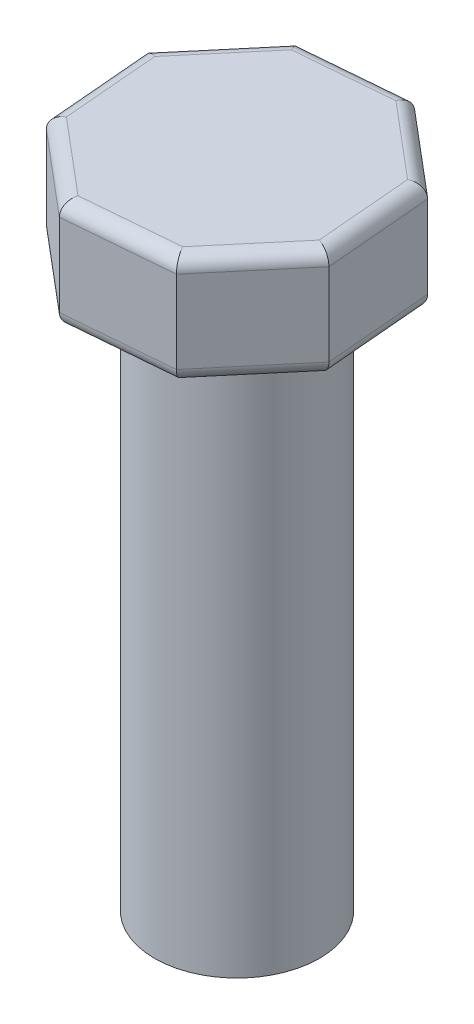
ISO-10303-21;
HEADER;
FILE_DESCRIPTION(('STEP AP214'),'2;1');
FILE_NAME('part.step','',(''),(''),'','','');
FILE_SCHEMA(('AUTOMOTIVE_DESIGN { 1 0 10303 214 1 1 1 1 }'));
ENDSEC;
DATA;
#1=APPLICATION_CONTEXT('core data for automotive mechanical design processes');
#2=APPLICATION_PROTOCOL_DEFINITION('international standard','automotive_design',2000,#1);
#3=PRODUCT_CONTEXT('',#1,'mechanical');
#4=PRODUCT('Part','Part','',(#3));
#5=PRODUCT_RELATED_PRODUCT_CATEGORY('part','',(#4));
#6=PRODUCT_DEFINITION_FORMATION('','',#4);
#7=PRODUCT_DEFINITION_CONTEXT('part definition',#1,'design');
#8=PRODUCT_DEFINITION('design','',#6,#7);
#9=PRODUCT_DEFINITION_SHAPE('','',#8);
#10=(LENGTH_UNIT() NAMED_UNIT(*) SI_UNIT(.MILLI.,.METRE.));
#11=(NAMED_UNIT(*) PLANE_ANGLE_UNIT() SI_UNIT($,.RADIAN.));
#12=(NAMED_UNIT(*) SI_UNIT($,.STERADIAN.) SOLID_ANGLE_UNIT());
#13=UNCERTAINTY_MEASURE_WITH_UNIT(LENGTH_MEASURE(1.E-05),#10,'distance_accuracy_value','');
#14=(GEOMETRIC_REPRESENTATION_CONTEXT(3) GLOBAL_UNCERTAINTY_ASSIGNED_CONTEXT((#13)) GLOBAL_UNIT_ASSIGNED_CONTEXT((#10,
#11,#12)) REPRESENTATION_CONTEXT('',''));
#15=CARTESIAN_POINT('',(0.,0.,0.));
#16=DIRECTION('',(0.,0.,1.));
#17=DIRECTION('',(1.,0.,0.));
#18=AXIS2_PLACEMENT_3D('',#15,#16,#17);
#19=CARTESIAN_POINT('',(0.,0.,0.));
#20=DIRECTION('',(0.,1.,0.));
#21=DIRECTION('',(0.,0.,1.));
#22=AXIS2_PLACEMENT_3D('',#19,#20,#21);
#23=PLANE('',#22);
#24=DIRECTION('',(0.764494083677081,0.,0.644630743932323));
#25=VECTOR('',#24,1.);
#26=CARTESIAN_POINT('',(-5.47936132342475,0.,6.49819971125519));
#27=LINE('',#26,#25);
#28=CARTESIAN_POINT('',(-2.78771887201392,0.,8.76782548456031));
#29=VERTEX_POINT('',#28);
#30=CARTESIAN_POINT('',(-8.17100377483558,0.,4.22857393795007));
#31=VERTEX_POINT('',#30);
#32=EDGE_CURVE('E43',#29,#31,#27,.F.);
#33=ORIENTED_EDGE('',*,*,#32,.T.);
#34=DIRECTION('',(0.0847561803491822,0.,0.996401721140935));
#35=VECTOR('',#34,1.);
#36=CARTESIAN_POINT('',(-8.46941462969793,0.,0.720427532968048));
#37=LINE('',#36,#35);
#38=CARTESIAN_POINT('',(-8.76782548456027,0.,-2.78771887201375));
#39=VERTEX_POINT('',#38);
#40=EDGE_CURVE('E11',#31,#39,#37,.F.);
#41=ORIENTED_EDGE('',*,*,#40,.T.);
#42=DIRECTION('',(-0.644630743932324,0.,0.76449408367708));
#43=VECTOR('',#42,1.);
#44=CARTESIAN_POINT('',(-6.49819971125507,0.,-5.47936132342467));
#45=LINE('',#44,#43);
#46=CARTESIAN_POINT('',(-4.22857393795002,0.,-8.17100377483541));
#47=VERTEX_POINT('',#46);
#48=EDGE_CURVE('E235',#39,#47,#45,.F.);
#49=ORIENTED_EDGE('',*,*,#48,.T.);
#50=DIRECTION('',(-0.996401721140935,0.,0.0847561803491839));
#51=VECTOR('',#50,1.);
#52=CARTESIAN_POINT('',(-0.720427532968049,0.,-8.46941462969777));
#53=LINE('',#52,#51);
#54=CARTESIAN_POINT('',(2.78771887201394,0.,-8.76782548456013));
#55=VERTEX_POINT('',#54);
#56=EDGE_CURVE('E233',#47,#55,#53,.F.);
#57=ORIENTED_EDGE('',*,*,#56,.T.);
#58=DIRECTION('',(-0.764494083677079,0.,-0.644630743932325));
#59=VECTOR('',#58,1.);
#60=CARTESIAN_POINT('',(5.47936132342468,0.,-6.49819971125508));
#61=LINE('',#60,#59);
#62=CARTESIAN_POINT('',(8.1710037748356,0.,-4.22857393794987));
#63=VERTEX_POINT('',#62);
#64=EDGE_CURVE('E231',#55,#63,#61,.F.);
#65=ORIENTED_EDGE('',*,*,#64,.T.);
#66=DIRECTION('',(-0.0847561803491809,0.,-0.996401721140935));
#67=VECTOR('',#66,1.);
#68=CARTESIAN_POINT('',(8.46941462969794,0.,-0.720427532968037));
#69=LINE('',#68,#67);
#70=CARTESIAN_POINT('',(8.7678254845603,0.,2.78771887201405));
#71=VERTEX_POINT('',#70);
#72=EDGE_CURVE('E229',#63,#71,#69,.F.);
#73=ORIENTED_EDGE('',*,*,#72,.T.);
#74=DIRECTION('',(0.644630743932331,0.,-0.764494083677074));
#75=VECTOR('',#74,1.);
#76=CARTESIAN_POINT('',(6.49819971125516,0.,5.47936132342484));
#77=LINE('',#76,#75);
#78=CARTESIAN_POINT('',(4.22857393795007,0.,8.17100377483558));
#79=VERTEX_POINT('',#78);
#80=EDGE_CURVE('E227',#71,#79,#77,.F.);
#81=ORIENTED_EDGE('',*,*,#80,.T.);
#82=DIRECTION('',(0.996401721140935,0.,-0.0847561803491851));
#83=VECTOR('',#82,1.);
#84=CARTESIAN_POINT('',(0.720427532968073,0.,8.46941462969794));
#85=LINE('',#84,#83);
#86=EDGE_CURVE('E225',#79,#29,#85,.F.);
#87=ORIENTED_EDGE('',*,*,#86,.T.);
#88=EDGE_LOOP('',(#33,#41,#49,#57,#65,#73,#81,#87));
#89=FACE_BOUND('',#88,.T.);
#90=CARTESIAN_POINT('',(0.,0.,0.));
#91=DIRECTION('',(0.,1.,0.));
#92=DIRECTION('',(0.,0.,1.));
#93=AXIS2_PLACEMENT_3D('',#90,#91,#92);
#94=CIRCLE('',#93,6.);
#95=CARTESIAN_POINT('',(0.,0.,6.));
#96=VERTEX_POINT('',#95);
#97=EDGE_CURVE('E174',#96,#96,#94,.F.);
#98=ORIENTED_EDGE('',*,*,#97,.F.);
#99=EDGE_LOOP('',(#98));
#100=FACE_BOUND('',#99,.T.);
#101=ADVANCED_FACE('F34',(#89,#100),#23,.F.);
#102=CARTESIAN_POINT('',(3.11568579813323,8.,-9.79933436509664));
#103=DIRECTION('',(0.0847561803491839,0.,0.996401721140935));
#104=DIRECTION('',(0.996401721140935,0.,-0.0847561803491839));
#105=AXIS2_PLACEMENT_3D('',#102,#103,#104);
#106=PLANE('',#105);
#107=DIRECTION('',(0.,-1.,0.));
#108=VECTOR('',#107,1.);
#109=CARTESIAN_POINT('',(-4.72605322476767,8.,-9.13229833658077));
#110=LINE('',#109,#108);
#111=CARTESIAN_POINT('',(-4.72605322476767,7.,-9.13229833658077));
#112=VERTEX_POINT('',#111);
#113=CARTESIAN_POINT('',(-4.72605322476767,1.,-9.13229833658077));
#114=VERTEX_POINT('',#113);
#115=EDGE_CURVE('E177',#112,#114,#110,.T.);
#116=ORIENTED_EDGE('',*,*,#115,.F.);
#117=DIRECTION('',(-0.996401721140935,0.,0.0847561803491839));
#118=VECTOR('',#117,1.);
#119=CARTESIAN_POINT('',(3.11568579813323,7.,-9.79933436509664));
#120=LINE('',#119,#118);
#121=CARTESIAN_POINT('',(3.11568579813323,7.,-9.79933436509664));
#122=VERTEX_POINT('',#121);
#123=EDGE_CURVE('E203',#112,#122,#120,.F.);
#124=ORIENTED_EDGE('',*,*,#123,.T.);
#125=DIRECTION('',(0.,-1.,0.));
#126=VECTOR('',#125,1.);
#127=CARTESIAN_POINT('',(3.11568579813323,8.,-9.79933436509664));
#128=LINE('',#127,#126);
#129=CARTESIAN_POINT('',(3.11568579813323,1.,-9.79933436509664));
#130=VERTEX_POINT('',#129);
#131=EDGE_CURVE('E323',#122,#130,#128,.T.);
#132=ORIENTED_EDGE('',*,*,#131,.T.);
#133=DIRECTION('',(-0.996401721140935,0.,0.0847561803491839));
#134=VECTOR('',#133,1.);
#135=CARTESIAN_POINT('',(3.11568579813323,1.,-9.79933436509664));
#136=LINE('',#135,#134);
#137=EDGE_CURVE('E201',#130,#114,#136,.T.);
#138=ORIENTED_EDGE('',*,*,#137,.T.);
#139=EDGE_LOOP('',(#116,#124,#132,#138));
#140=FACE_BOUND('',#139,.T.);
#141=ADVANCED_FACE('F337',(#140),#106,.F.);
#142=CARTESIAN_POINT('',(-4.72605322476767,8.,-9.13229833658077));
#143=DIRECTION('',(0.76449408367708,0.,0.644630743932324));
#144=DIRECTION('',(0.644630743932324,0.,-0.76449408367708));
#145=AXIS2_PLACEMENT_3D('',#142,#143,#144);
#146=PLANE('',#145);
#147=DIRECTION('',(0.,-1.,0.));
#148=VECTOR('',#147,1.);
#149=CARTESIAN_POINT('',(-9.79933436509678,8.,-3.11568579813304));
#150=LINE('',#149,#148);
#151=CARTESIAN_POINT('',(-9.79933436509678,7.,-3.11568579813304));
#152=VERTEX_POINT('',#151);
#153=CARTESIAN_POINT('',(-9.79933436509678,1.,-3.11568579813304));
#154=VERTEX_POINT('',#153);
#155=EDGE_CURVE('E299',#152,#154,#150,.T.);
#156=ORIENTED_EDGE('',*,*,#155,.F.);
#157=DIRECTION('',(-0.644630743932324,0.,0.76449408367708));
#158=VECTOR('',#157,1.);
#159=CARTESIAN_POINT('',(-4.72605322476767,7.,-9.13229833658077));
#160=LINE('',#159,#158);
#161=EDGE_CURVE('E207',#152,#112,#160,.F.);
#162=ORIENTED_EDGE('',*,*,#161,.T.);
#163=ORIENTED_EDGE('',*,*,#115,.T.);
#164=DIRECTION('',(-0.644630743932324,0.,0.76449408367708));
#165=VECTOR('',#164,1.);
#166=CARTESIAN_POINT('',(-4.72605322476767,1.,-9.13229833658077));
#167=LINE('',#166,#165);
#168=EDGE_CURVE('E205',#114,#154,#167,.T.);
#169=ORIENTED_EDGE('',*,*,#168,.T.);
#170=EDGE_LOOP('',(#156,#162,#163,#169));
#171=FACE_BOUND('',#170,.T.);
#172=ADVANCED_FACE('F298',(#171),#146,.F.);
#173=CARTESIAN_POINT('',(-9.79933436509678,8.,-3.11568579813304));
#174=DIRECTION('',(0.996401721140935,0.,-0.0847561803491822));
#175=DIRECTION('',(-0.0847561803491822,0.,-0.996401721140935));
#176=AXIS2_PLACEMENT_3D('',#173,#174,#175);
#177=PLANE('',#176);
#178=DIRECTION('',(0.,-1.,0.));
#179=VECTOR('',#178,1.);
#180=CARTESIAN_POINT('',(-9.13229833658094,8.,4.72605322476772));
#181=LINE('',#180,#179);
#182=CARTESIAN_POINT('',(-9.13229833658094,7.,4.72605322476772));
#183=VERTEX_POINT('',#182);
#184=CARTESIAN_POINT('',(-9.13229833658094,1.,4.72605322476772));
#185=VERTEX_POINT('',#184);
#186=EDGE_CURVE('E307',#183,#185,#181,.T.);
#187=ORIENTED_EDGE('',*,*,#186,.F.);
#188=DIRECTION('',(0.0847561803491822,0.,0.996401721140935));
#189=VECTOR('',#188,1.);
#190=CARTESIAN_POINT('',(-9.79933436509678,7.,-3.11568579813304));
#191=LINE('',#190,#189);
#192=EDGE_CURVE('E212',#183,#152,#191,.F.);
#193=ORIENTED_EDGE('',*,*,#192,.T.);
#194=ORIENTED_EDGE('',*,*,#155,.T.);
#195=DIRECTION('',(0.0847561803491822,0.,0.996401721140935));
#196=VECTOR('',#195,1.);
#197=CARTESIAN_POINT('',(-9.79933436509678,1.,-3.11568579813304));
#198=LINE('',#197,#196);
#199=EDGE_CURVE('E209',#154,#185,#198,.T.);
#200=ORIENTED_EDGE('',*,*,#199,.T.);
#201=EDGE_LOOP('',(#187,#193,#194,#200));
#202=FACE_BOUND('',#201,.T.);
#203=ADVANCED_FACE('F304',(#202),#177,.F.);
#204=CARTESIAN_POINT('',(-9.13229833658094,8.,4.72605322476772));
#205=DIRECTION('',(0.644630743932323,0.,-0.764494083677081));
#206=DIRECTION('',(-0.764494083677081,0.,-0.644630743932323));
#207=AXIS2_PLACEMENT_3D('',#204,#205,#206);
#208=PLANE('',#207);
#209=DIRECTION('',(0.,-1.,0.));
#210=VECTOR('',#209,1.);
#211=CARTESIAN_POINT('',(-3.1156857981332,8.,9.79933436509682));
#212=LINE('',#211,#210);
#213=CARTESIAN_POINT('',(-3.1156857981332,7.,9.79933436509682));
#214=VERTEX_POINT('',#213);
#215=CARTESIAN_POINT('',(-3.1156857981332,1.,9.79933436509682));
#216=VERTEX_POINT('',#215);
#217=EDGE_CURVE('E309',#214,#216,#212,.T.);
#218=ORIENTED_EDGE('',*,*,#217,.F.);
#219=DIRECTION('',(0.764494083677081,0.,0.644630743932323));
#220=VECTOR('',#219,1.);
#221=CARTESIAN_POINT('',(-9.13229833658094,7.,4.72605322476772));
#222=LINE('',#221,#220);
#223=EDGE_CURVE('E216',#214,#183,#222,.F.);
#224=ORIENTED_EDGE('',*,*,#223,.T.);
#225=ORIENTED_EDGE('',*,*,#186,.T.);
#226=DIRECTION('',(0.764494083677081,0.,0.644630743932323));
#227=VECTOR('',#226,1.);
#228=CARTESIAN_POINT('',(-9.13229833658094,1.,4.72605322476772));
#229=LINE('',#228,#227);
#230=EDGE_CURVE('E214',#185,#216,#229,.T.);
#231=ORIENTED_EDGE('',*,*,#230,.T.);
#232=EDGE_LOOP('',(#218,#224,#225,#231));
#233=FACE_BOUND('',#232,.T.);
#234=ADVANCED_FACE('F361',(#233),#208,.F.);
#235=CARTESIAN_POINT('',(-3.1156857981332,8.,9.79933436509682));
#236=DIRECTION('',(-0.0847561803491851,0.,-0.996401721140934));
#237=DIRECTION('',(-0.996401721140935,0.,0.0847561803491851));
#238=AXIS2_PLACEMENT_3D('',#235,#236,#237);
#239=PLANE('',#238);
#240=DIRECTION('',(0.,-1.,0.));
#241=VECTOR('',#240,1.);
#242=CARTESIAN_POINT('',(4.72605322476772,8.,9.13229833658094));
#243=LINE('',#242,#241);
#244=CARTESIAN_POINT('',(4.72605322476772,7.,9.13229833658094));
#245=VERTEX_POINT('',#244);
#246=CARTESIAN_POINT('',(4.72605322476772,1.,9.13229833658094));
#247=VERTEX_POINT('',#246);
#248=EDGE_CURVE('E314',#245,#247,#243,.T.);
#249=ORIENTED_EDGE('',*,*,#248,.F.);
#250=DIRECTION('',(0.996401721140935,0.,-0.0847561803491851));
#251=VECTOR('',#250,1.);
#252=CARTESIAN_POINT('',(-3.1156857981332,7.,9.79933436509682));
#253=LINE('',#252,#251);
#254=EDGE_CURVE('E165',#245,#214,#253,.F.);
#255=ORIENTED_EDGE('',*,*,#254,.T.);
#256=ORIENTED_EDGE('',*,*,#217,.T.);
#257=DIRECTION('',(0.996401721140935,0.,-0.0847561803491851));
#258=VECTOR('',#257,1.);
#259=CARTESIAN_POINT('',(-3.1156857981332,1.,9.79933436509682));
#260=LINE('',#259,#258);
#261=EDGE_CURVE('E218',#216,#247,#260,.T.);
#262=ORIENTED_EDGE('',*,*,#261,.T.);
#263=EDGE_LOOP('',(#249,#255,#256,#262));
#264=FACE_BOUND('',#263,.T.);
#265=ADVANCED_FACE('F357',(#264),#239,.F.);
#266=CARTESIAN_POINT('',(4.72605322476772,8.,9.13229833658094));
#267=DIRECTION('',(-0.764494083677074,0.,-0.644630743932331));
#268=DIRECTION('',(-0.644630743932331,0.,0.764494083677074));
#269=AXIS2_PLACEMENT_3D('',#266,#267,#268);
#270=PLANE('',#269);
#271=DIRECTION('',(0.,-1.,0.));
#272=VECTOR('',#271,1.);
#273=CARTESIAN_POINT('',(9.79933436509681,8.,3.11568579813334));
#274=LINE('',#273,#272);
#275=CARTESIAN_POINT('',(9.79933436509681,7.,3.11568579813334));
#276=VERTEX_POINT('',#275);
#277=CARTESIAN_POINT('',(9.79933436509681,1.,3.11568579813334));
#278=VERTEX_POINT('',#277);
#279=EDGE_CURVE('E317',#276,#278,#274,.T.);
#280=ORIENTED_EDGE('',*,*,#279,.F.);
#281=DIRECTION('',(0.644630743932331,0.,-0.764494083677074));
#282=VECTOR('',#281,1.);
#283=CARTESIAN_POINT('',(4.72605322476772,7.,9.13229833658094));
#284=LINE('',#283,#282);
#285=EDGE_CURVE('E223',#276,#245,#284,.F.);
#286=ORIENTED_EDGE('',*,*,#285,.T.);
#287=ORIENTED_EDGE('',*,*,#248,.T.);
#288=DIRECTION('',(0.644630743932331,0.,-0.764494083677074));
#289=VECTOR('',#288,1.);
#290=CARTESIAN_POINT('',(4.72605322476772,1.,9.13229833658094));
#291=LINE('',#290,#289);
#292=EDGE_CURVE('E221',#247,#278,#291,.T.);
#293=ORIENTED_EDGE('',*,*,#292,.T.);
#294=EDGE_LOOP('',(#280,#286,#287,#293));
#295=FACE_BOUND('',#294,.T.);
#296=ADVANCED_FACE('F353',(#295),#270,.F.);
#297=CARTESIAN_POINT('',(9.79933436509681,8.,3.11568579813334));
#298=DIRECTION('',(-0.996401721140935,0.,0.0847561803491809));
#299=DIRECTION('',(0.0847561803491809,0.,0.996401721140935));
#300=AXIS2_PLACEMENT_3D('',#297,#298,#299);
#301=PLANE('',#300);
#302=DIRECTION('',(0.,-1.,0.));
#303=VECTOR('',#302,1.);
#304=CARTESIAN_POINT('',(9.13229833658097,8.,-4.72605322476752));
#305=LINE('',#304,#303);
#306=CARTESIAN_POINT('',(9.13229833658097,7.,-4.72605322476752));
#307=VERTEX_POINT('',#306);
#308=CARTESIAN_POINT('',(9.13229833658097,1.,-4.72605322476752));
#309=VERTEX_POINT('',#308);
#310=EDGE_CURVE('E320',#307,#309,#305,.T.);
#311=ORIENTED_EDGE('',*,*,#310,.F.);
#312=DIRECTION('',(-0.0847561803491809,0.,-0.996401721140935));
#313=VECTOR('',#312,1.);
#314=CARTESIAN_POINT('',(9.79933436509681,7.,3.11568579813334));
#315=LINE('',#314,#313);
#316=EDGE_CURVE('E194',#307,#276,#315,.F.);
#317=ORIENTED_EDGE('',*,*,#316,.T.);
#318=ORIENTED_EDGE('',*,*,#279,.T.);
#319=DIRECTION('',(-0.0847561803491809,0.,-0.996401721140935));
#320=VECTOR('',#319,1.);
#321=CARTESIAN_POINT('',(9.79933436509681,1.,3.11568579813334));
#322=LINE('',#321,#320);
#323=EDGE_CURVE('E192',#278,#309,#322,.T.);
#324=ORIENTED_EDGE('',*,*,#323,.T.);
#325=EDGE_LOOP('',(#311,#317,#318,#324));
#326=FACE_BOUND('',#325,.T.);
#327=ADVANCED_FACE('F349',(#326),#301,.F.);
#328=CARTESIAN_POINT('',(9.13229833658097,8.,-4.72605322476752));
#329=DIRECTION('',(-0.644630743932325,0.,0.764494083677079));
#330=DIRECTION('',(0.764494083677079,0.,0.644630743932325));
#331=AXIS2_PLACEMENT_3D('',#328,#329,#330);
#332=PLANE('',#331);
#333=ORIENTED_EDGE('',*,*,#131,.F.);
#334=DIRECTION('',(-0.764494083677079,0.,-0.644630743932325));
#335=VECTOR('',#334,1.);
#336=CARTESIAN_POINT('',(9.13229833658097,7.,-4.72605322476752));
#337=LINE('',#336,#335);
#338=EDGE_CURVE('E199',#122,#307,#337,.F.);
#339=ORIENTED_EDGE('',*,*,#338,.T.);
#340=ORIENTED_EDGE('',*,*,#310,.T.);
#341=DIRECTION('',(-0.764494083677079,0.,-0.644630743932325));
#342=VECTOR('',#341,1.);
#343=CARTESIAN_POINT('',(9.13229833658097,1.,-4.72605322476752));
#344=LINE('',#343,#342);
#345=EDGE_CURVE('E197',#309,#130,#344,.T.);
#346=ORIENTED_EDGE('',*,*,#345,.T.);
#347=EDGE_LOOP('',(#333,#339,#340,#346));
#348=FACE_BOUND('',#347,.T.);
#349=ADVANCED_FACE('F346',(#348),#332,.F.);
#350=CARTESIAN_POINT('',(0.,8.,0.));
#351=DIRECTION('',(0.,1.,0.));
#352=DIRECTION('',(0.,0.,1.));
#353=AXIS2_PLACEMENT_3D('',#350,#351,#352);
#354=PLANE('',#353);
#355=DIRECTION('',(0.644630743932331,0.,-0.764494083677074));
#356=VECTOR('',#355,1.);
#357=CARTESIAN_POINT('',(9.03484028141973,8.,2.47105505420101));
#358=LINE('',#357,#356);
#359=CARTESIAN_POINT('',(4.22857393795007,8.,8.17100377483558));
#360=VERTEX_POINT('',#359);
#361=CARTESIAN_POINT('',(8.7678254845603,8.,2.78771887201405));
#362=VERTEX_POINT('',#361);
#363=EDGE_CURVE('E153',#360,#362,#358,.T.);
#364=ORIENTED_EDGE('',*,*,#363,.T.);
#365=DIRECTION('',(-0.0847561803491809,0.,-0.996401721140935));
#366=VECTOR('',#365,1.);
#367=CARTESIAN_POINT('',(8.13589661544003,8.,-4.64129704441834));
#368=LINE('',#367,#366);
#369=CARTESIAN_POINT('',(8.1710037748356,8.,-4.22857393794986));
#370=VERTEX_POINT('',#369);
#371=EDGE_CURVE('E190',#362,#370,#368,.T.);
#372=ORIENTED_EDGE('',*,*,#371,.T.);
#373=DIRECTION('',(-0.764494083677079,0.,-0.644630743932325));
#374=VECTOR('',#373,1.);
#375=CARTESIAN_POINT('',(2.47105505420091,8.,-9.03484028141956));
#376=LINE('',#375,#374);
#377=CARTESIAN_POINT('',(2.78771887201394,8.,-8.76782548456013));
#378=VERTEX_POINT('',#377);
#379=EDGE_CURVE('E188',#370,#378,#376,.T.);
#380=ORIENTED_EDGE('',*,*,#379,.T.);
#381=DIRECTION('',(-0.996401721140935,0.,0.0847561803491839));
#382=VECTOR('',#381,1.);
#383=CARTESIAN_POINT('',(-4.64129704441849,8.,-8.13589661543984));
#384=LINE('',#383,#382);
#385=CARTESIAN_POINT('',(-4.22857393795002,8.,-8.17100377483541));
#386=VERTEX_POINT('',#385);
#387=EDGE_CURVE('E186',#378,#386,#384,.T.);
#388=ORIENTED_EDGE('',*,*,#387,.T.);
#389=DIRECTION('',(-0.644630743932324,0.,0.76449408367708));
#390=VECTOR('',#389,1.);
#391=CARTESIAN_POINT('',(-9.0348402814197,8.,-2.47105505420072));
#392=LINE('',#391,#390);
#393=CARTESIAN_POINT('',(-8.76782548456027,8.,-2.78771887201375));
#394=VERTEX_POINT('',#393);
#395=EDGE_CURVE('E184',#386,#394,#392,.T.);
#396=ORIENTED_EDGE('',*,*,#395,.T.);
#397=DIRECTION('',(0.0847561803491822,0.,0.996401721140935));
#398=VECTOR('',#397,1.);
#399=CARTESIAN_POINT('',(-8.13589661544001,8.,4.64129704441854));
#400=LINE('',#399,#398);
#401=CARTESIAN_POINT('',(-8.17100377483558,8.,4.22857393795007));
#402=VERTEX_POINT('',#401);
#403=EDGE_CURVE('E182',#394,#402,#400,.T.);
#404=ORIENTED_EDGE('',*,*,#403,.T.);
#405=DIRECTION('',(0.764494083677081,0.,0.644630743932323));
#406=VECTOR('',#405,1.);
#407=CARTESIAN_POINT('',(-2.47105505420088,8.,9.03484028141974));
#408=LINE('',#407,#406);
#409=CARTESIAN_POINT('',(-2.78771887201392,8.,8.76782548456031));
#410=VERTEX_POINT('',#409);
#411=EDGE_CURVE('E156',#402,#410,#408,.T.);
#412=ORIENTED_EDGE('',*,*,#411,.T.);
#413=DIRECTION('',(0.996401721140935,0.,-0.0847561803491851));
#414=VECTOR('',#413,1.);
#415=CARTESIAN_POINT('',(4.64129704441854,8.,8.13589661544001));
#416=LINE('',#415,#414);
#417=EDGE_CURVE('E148',#410,#360,#416,.T.);
#418=ORIENTED_EDGE('',*,*,#417,.T.);
#419=EDGE_LOOP('',(#364,#372,#380,#388,#396,#404,#412,#418));
#420=FACE_BOUND('',#419,.T.);
#421=ADVANCED_FACE('F150',(#420),#354,.T.);
#422=CARTESIAN_POINT('',(0.,-40.,0.));
#423=DIRECTION('',(0.,1.,0.));
#424=DIRECTION('',(0.,0.,1.));
#425=AXIS2_PLACEMENT_3D('',#422,#423,#424);
#426=CYLINDRICAL_SURFACE('',#425,6.);
#427=CARTESIAN_POINT('',(0.,-40.,0.));
#428=DIRECTION('',(0.,-1.,0.));
#429=DIRECTION('',(0.,0.,-1.));
#430=AXIS2_PLACEMENT_3D('',#427,#428,#429);
#431=CIRCLE('',#430,6.);
#432=CARTESIAN_POINT('',(0.,-40.,-6.));
#433=VERTEX_POINT('',#432);
#434=EDGE_CURVE('E253',#433,#433,#431,.T.);
#435=ORIENTED_EDGE('',*,*,#434,.F.);
#436=EDGE_LOOP('',(#435));
#437=FACE_BOUND('',#436,.T.);
#438=ORIENTED_EDGE('',*,*,#97,.T.);
#439=EDGE_LOOP('',(#438));
#440=FACE_BOUND('',#439,.T.);
#441=ADVANCED_FACE('F331',(#437,#440),#426,.T.);
#442=CARTESIAN_POINT('',(0.,-40.,0.));
#443=DIRECTION('',(0.,-1.,0.));
#444=DIRECTION('',(0.,0.,-1.));
#445=AXIS2_PLACEMENT_3D('',#442,#443,#444);
#446=PLANE('',#445);
#447=ORIENTED_EDGE('',*,*,#434,.T.);
#448=EDGE_LOOP('',(#447));
#449=FACE_BOUND('',#448,.T.);
#450=ADVANCED_FACE('F329',(#449),#446,.T.);
#451=CARTESIAN_POINT('',(-8.46941462969793,7.,0.720427532968048));
#452=DIRECTION('',(-0.0847561803491822,0.,-0.996401721140935));
#453=DIRECTION('',(-0.996401721140935,0.,0.0847561803491822));
#454=AXIS2_PLACEMENT_3D('',#451,#452,#453);
#455=CYLINDRICAL_SURFACE('',#454,1.);
#456=CARTESIAN_POINT('',(-8.76782548456027,7.,-2.78771887201375));
#457=DIRECTION('',(0.30300193038225,0.,-0.952989942331308));
#458=DIRECTION('',(-0.952989942331308,0.,-0.303001930382251));
#459=AXIS2_PLACEMENT_3D('',#456,#457,#458);
#460=ELLIPSE('',#459,1.08239220029239,1.);
#461=EDGE_CURVE('E247',#152,#394,#460,.T.);
#462=ORIENTED_EDGE('',*,*,#461,.F.);
#463=ORIENTED_EDGE('',*,*,#192,.F.);
#464=CARTESIAN_POINT('',(-8.17100377483557,7.,4.22857393795007));
#465=DIRECTION('',(-0.459610930939142,0.,-0.888120370310948));
#466=DIRECTION('',(-0.888120370310948,0.,0.459610930939142));
#467=AXIS2_PLACEMENT_3D('',#464,#465,#466);
#468=ELLIPSE('',#467,1.08239220029239,1.);
#469=EDGE_CURVE('E250',#402,#183,#468,.F.);
#470=ORIENTED_EDGE('',*,*,#469,.F.);
#471=ORIENTED_EDGE('',*,*,#403,.F.);
#472=EDGE_LOOP('',(#462,#463,#470,#471));
#473=FACE_BOUND('',#472,.T.);
#474=ADVANCED_FACE('F393',(#473),#455,.T.);
#475=CARTESIAN_POINT('',(-5.47936132342475,7.,6.49819971125519));
#476=DIRECTION('',(-0.764494083677081,0.,-0.644630743932323));
#477=DIRECTION('',(-0.644630743932323,0.,0.764494083677081));
#478=AXIS2_PLACEMENT_3D('',#475,#476,#477);
#479=CYLINDRICAL_SURFACE('',#478,1.);
#480=ORIENTED_EDGE('',*,*,#469,.T.);
#481=ORIENTED_EDGE('',*,*,#223,.F.);
#482=CARTESIAN_POINT('',(-2.78771887201392,7.,8.76782548456031));
#483=DIRECTION('',(-0.952989942331309,0.,-0.303001930382248));
#484=DIRECTION('',(-0.303001930382249,0.,0.952989942331309));
#485=AXIS2_PLACEMENT_3D('',#482,#483,#484);
#486=ELLIPSE('',#485,1.08239220029239,1.);
#487=EDGE_CURVE('E245',#410,#214,#486,.F.);
#488=ORIENTED_EDGE('',*,*,#487,.F.);
#489=ORIENTED_EDGE('',*,*,#411,.F.);
#490=EDGE_LOOP('',(#480,#481,#488,#489));
#491=FACE_BOUND('',#490,.T.);
#492=ADVANCED_FACE('F389',(#491),#479,.T.);
#493=CARTESIAN_POINT('',(-6.49819971125507,7.,-5.47936132342467));
#494=DIRECTION('',(0.644630743932324,0.,-0.76449408367708));
#495=DIRECTION('',(-0.76449408367708,0.,-0.644630743932324));
#496=AXIS2_PLACEMENT_3D('',#493,#494,#495);
#497=CYLINDRICAL_SURFACE('',#496,1.);
#498=ORIENTED_EDGE('',*,*,#461,.T.);
#499=ORIENTED_EDGE('',*,*,#395,.F.);
#500=CARTESIAN_POINT('',(-4.22857393795002,7.,-8.17100377483541));
#501=DIRECTION('',(0.888120370310948,0.,-0.459610930939142));
#502=DIRECTION('',(-0.459610930939142,0.,-0.888120370310948));
#503=AXIS2_PLACEMENT_3D('',#500,#501,#502);
#504=ELLIPSE('',#503,1.08239220029239,1.);
#505=EDGE_CURVE('E168',#112,#386,#504,.T.);
#506=ORIENTED_EDGE('',*,*,#505,.F.);
#507=ORIENTED_EDGE('',*,*,#161,.F.);
#508=EDGE_LOOP('',(#498,#499,#506,#507));
#509=FACE_BOUND('',#508,.T.);
#510=ADVANCED_FACE('F386',(#509),#497,.T.);
#511=CARTESIAN_POINT('',(0.720427532968073,7.,8.46941462969794));
#512=DIRECTION('',(-0.996401721140935,0.,0.0847561803491851));
#513=DIRECTION('',(0.0847561803491851,0.,0.996401721140934));
#514=AXIS2_PLACEMENT_3D('',#511,#512,#513);
#515=CYLINDRICAL_SURFACE('',#514,1.);
#516=ORIENTED_EDGE('',*,*,#487,.T.);
#517=ORIENTED_EDGE('',*,*,#254,.F.);
#518=CARTESIAN_POINT('',(4.22857393795007,7.,8.17100377483558));
#519=DIRECTION('',(-0.88812037031095,0.,0.459610930939139));
#520=DIRECTION('',(0.459610930939139,0.,0.88812037031095));
#521=AXIS2_PLACEMENT_3D('',#518,#519,#520);
#522=ELLIPSE('',#521,1.08239220029239,1.);
#523=EDGE_CURVE('E163',#360,#245,#522,.F.);
#524=ORIENTED_EDGE('',*,*,#523,.F.);
#525=ORIENTED_EDGE('',*,*,#417,.F.);
#526=EDGE_LOOP('',(#516,#517,#524,#525));
#527=FACE_BOUND('',#526,.T.);
#528=ADVANCED_FACE('F164',(#527),#515,.T.);
#529=CARTESIAN_POINT('',(-0.720427532968049,7.,-8.46941462969777));
#530=DIRECTION('',(0.996401721140935,0.,-0.0847561803491839));
#531=DIRECTION('',(-0.0847561803491839,0.,-0.996401721140935));
#532=AXIS2_PLACEMENT_3D('',#529,#530,#531);
#533=CYLINDRICAL_SURFACE('',#532,1.);
#534=ORIENTED_EDGE('',*,*,#505,.T.);
#535=ORIENTED_EDGE('',*,*,#387,.F.);
#536=CARTESIAN_POINT('',(2.78771887201395,7.,-8.76782548456013));
#537=DIRECTION('',(0.952989942331308,0.,0.30300193038225));
#538=DIRECTION('',(0.30300193038225,0.,-0.952989942331308));
#539=AXIS2_PLACEMENT_3D('',#536,#537,#538);
#540=ELLIPSE('',#539,1.08239220029239,1.);
#541=EDGE_CURVE('E169',#122,#378,#540,.T.);
#542=ORIENTED_EDGE('',*,*,#541,.F.);
#543=ORIENTED_EDGE('',*,*,#123,.F.);
#544=EDGE_LOOP('',(#534,#535,#542,#543));
#545=FACE_BOUND('',#544,.T.);
#546=ADVANCED_FACE('F380',(#545),#533,.T.);
#547=CARTESIAN_POINT('',(6.49819971125516,7.,5.47936132342484));
#548=DIRECTION('',(-0.644630743932331,0.,0.764494083677074));
#549=DIRECTION('',(0.764494083677074,0.,0.644630743932331));
#550=AXIS2_PLACEMENT_3D('',#547,#548,#549);
#551=CYLINDRICAL_SURFACE('',#550,1.);
#552=ORIENTED_EDGE('',*,*,#523,.T.);
#553=ORIENTED_EDGE('',*,*,#285,.F.);
#554=CARTESIAN_POINT('',(8.7678254845603,7.,2.78771887201405));
#555=DIRECTION('',(-0.303001930382255,0.,0.952989942331306));
#556=DIRECTION('',(-0.952989942331307,0.,-0.303001930382255));
#557=AXIS2_PLACEMENT_3D('',#554,#555,#556);
#558=ELLIPSE('',#557,1.0823922002924,1.);
#559=EDGE_CURVE('E172',#362,#276,#558,.F.);
#560=ORIENTED_EDGE('',*,*,#559,.F.);
#561=ORIENTED_EDGE('',*,*,#363,.F.);
#562=EDGE_LOOP('',(#552,#553,#560,#561));
#563=FACE_BOUND('',#562,.T.);
#564=ADVANCED_FACE('F171',(#563),#551,.T.);
#565=CARTESIAN_POINT('',(5.47936132342468,7.,-6.49819971125508));
#566=DIRECTION('',(0.764494083677079,0.,0.644630743932325));
#567=DIRECTION('',(0.644630743932325,0.,-0.764494083677079));
#568=AXIS2_PLACEMENT_3D('',#565,#566,#567);
#569=CYLINDRICAL_SURFACE('',#568,1.);
#570=ORIENTED_EDGE('',*,*,#541,.T.);
#571=ORIENTED_EDGE('',*,*,#379,.F.);
#572=CARTESIAN_POINT('',(8.1710037748356,7.,-4.22857393794986));
#573=DIRECTION('',(0.45961093093914,0.,0.888120370310949));
#574=DIRECTION('',(0.888120370310949,0.,-0.45961093093914));
#575=AXIS2_PLACEMENT_3D('',#572,#573,#574);
#576=ELLIPSE('',#575,1.08239220029239,1.);
#577=EDGE_CURVE('E238',#307,#370,#576,.T.);
#578=ORIENTED_EDGE('',*,*,#577,.F.);
#579=ORIENTED_EDGE('',*,*,#338,.F.);
#580=EDGE_LOOP('',(#570,#571,#578,#579));
#581=FACE_BOUND('',#580,.T.);
#582=ADVANCED_FACE('F373',(#581),#569,.T.);
#583=CARTESIAN_POINT('',(8.46941462969794,7.,-0.720427532968037));
#584=DIRECTION('',(0.0847561803491809,0.,0.996401721140935));
#585=DIRECTION('',(0.996401721140935,0.,-0.0847561803491809));
#586=AXIS2_PLACEMENT_3D('',#583,#584,#585);
#587=CYLINDRICAL_SURFACE('',#586,1.);
#588=ORIENTED_EDGE('',*,*,#559,.T.);
#589=ORIENTED_EDGE('',*,*,#316,.F.);
#590=ORIENTED_EDGE('',*,*,#577,.T.);
#591=ORIENTED_EDGE('',*,*,#371,.F.);
#592=EDGE_LOOP('',(#588,#589,#590,#591));
#593=FACE_BOUND('',#592,.T.);
#594=ADVANCED_FACE('F370',(#593),#587,.T.);
#595=CARTESIAN_POINT('',(8.80293264395587,1.,3.20044197848252));
#596=DIRECTION('',(-0.0847561803491809,0.,-0.996401721140935));
#597=DIRECTION('',(-0.996401721140935,0.,0.0847561803491809));
#598=AXIS2_PLACEMENT_3D('',#595,#596,#597);
#599=CYLINDRICAL_SURFACE('',#598,1.);
#600=CARTESIAN_POINT('',(8.7678254845603,1.,2.78771887201405));
#601=DIRECTION('',(0.303001930382255,0.,-0.952989942331306));
#602=DIRECTION('',(0.952989942331307,0.,0.303001930382255));
#603=AXIS2_PLACEMENT_3D('',#600,#601,#602);
#604=ELLIPSE('',#603,1.0823922002924,1.);
#605=EDGE_CURVE('E268',#71,#278,#604,.F.);
#606=ORIENTED_EDGE('',*,*,#605,.F.);
#607=ORIENTED_EDGE('',*,*,#72,.F.);
#608=CARTESIAN_POINT('',(8.1710037748356,1.,-4.22857393794986));
#609=DIRECTION('',(-0.45961093093914,0.,-0.888120370310949));
#610=DIRECTION('',(0.888120370310949,0.,-0.45961093093914));
#611=AXIS2_PLACEMENT_3D('',#608,#609,#610);
#612=ELLIPSE('',#611,1.08239220029239,1.);
#613=EDGE_CURVE('E38',#309,#63,#612,.T.);
#614=ORIENTED_EDGE('',*,*,#613,.F.);
#615=ORIENTED_EDGE('',*,*,#323,.F.);
#616=EDGE_LOOP('',(#606,#607,#614,#615));
#617=FACE_BOUND('',#616,.T.);
#618=ADVANCED_FACE('F36',(#617),#599,.T.);
#619=CARTESIAN_POINT('',(8.48766759264864,1.,-3.96155914109044));
#620=DIRECTION('',(-0.764494083677079,0.,-0.644630743932325));
#621=DIRECTION('',(-0.644630743932325,0.,0.764494083677079));
#622=AXIS2_PLACEMENT_3D('',#619,#620,#621);
#623=CYLINDRICAL_SURFACE('',#622,1.);
#624=ORIENTED_EDGE('',*,*,#613,.T.);
#625=ORIENTED_EDGE('',*,*,#64,.F.);
#626=CARTESIAN_POINT('',(2.78771887201395,1.,-8.76782548456013));
#627=DIRECTION('',(-0.952989942331308,0.,-0.30300193038225));
#628=DIRECTION('',(0.30300193038225,0.,-0.952989942331308));
#629=AXIS2_PLACEMENT_3D('',#626,#627,#628);
#630=ELLIPSE('',#629,1.08239220029239,1.);
#631=EDGE_CURVE('E266',#130,#55,#630,.T.);
#632=ORIENTED_EDGE('',*,*,#631,.F.);
#633=ORIENTED_EDGE('',*,*,#345,.F.);
#634=EDGE_LOOP('',(#624,#625,#632,#633));
#635=FACE_BOUND('',#634,.T.);
#636=ADVANCED_FACE('F279',(#635),#623,.T.);
#637=CARTESIAN_POINT('',(3.96155914109065,1.,8.48766759264861));
#638=DIRECTION('',(0.644630743932331,0.,-0.764494083677074));
#639=DIRECTION('',(-0.764494083677074,0.,-0.644630743932331));
#640=AXIS2_PLACEMENT_3D('',#637,#638,#639);
#641=CYLINDRICAL_SURFACE('',#640,1.);
#642=ORIENTED_EDGE('',*,*,#605,.T.);
#643=ORIENTED_EDGE('',*,*,#292,.F.);
#644=CARTESIAN_POINT('',(4.22857393795007,1.,8.17100377483558));
#645=DIRECTION('',(0.88812037031095,0.,-0.459610930939139));
#646=DIRECTION('',(0.459610930939139,0.,0.88812037031095));
#647=AXIS2_PLACEMENT_3D('',#644,#645,#646);
#648=ELLIPSE('',#647,1.08239220029239,1.);
#649=EDGE_CURVE('E263',#79,#247,#648,.F.);
#650=ORIENTED_EDGE('',*,*,#649,.F.);
#651=ORIENTED_EDGE('',*,*,#80,.F.);
#652=EDGE_LOOP('',(#642,#643,#650,#651));
#653=FACE_BOUND('',#652,.T.);
#654=ADVANCED_FACE('F413',(#653),#641,.T.);
#655=CARTESIAN_POINT('',(3.20044197848242,1.,-8.80293264395571));
#656=DIRECTION('',(-0.996401721140935,0.,0.0847561803491839));
#657=DIRECTION('',(0.0847561803491839,0.,0.996401721140935));
#658=AXIS2_PLACEMENT_3D('',#655,#656,#657);
#659=CYLINDRICAL_SURFACE('',#658,1.);
#660=ORIENTED_EDGE('',*,*,#631,.T.);
#661=ORIENTED_EDGE('',*,*,#56,.F.);
#662=CARTESIAN_POINT('',(-4.22857393795001,1.,-8.17100377483541));
#663=DIRECTION('',(-0.888120370310948,0.,0.459610930939142));
#664=DIRECTION('',(-0.459610930939142,0.,-0.888120370310948));
#665=AXIS2_PLACEMENT_3D('',#662,#663,#664);
#666=ELLIPSE('',#665,1.08239220029239,1.);
#667=EDGE_CURVE('E260',#114,#47,#666,.T.);
#668=ORIENTED_EDGE('',*,*,#667,.F.);
#669=ORIENTED_EDGE('',*,*,#137,.F.);
#670=EDGE_LOOP('',(#660,#661,#668,#669));
#671=FACE_BOUND('',#670,.T.);
#672=ADVANCED_FACE('F289',(#671),#659,.T.);
#673=CARTESIAN_POINT('',(-3.20044197848239,1.,8.80293264395588));
#674=DIRECTION('',(0.996401721140935,0.,-0.0847561803491851));
#675=DIRECTION('',(-0.0847561803491851,0.,-0.996401721140934));
#676=AXIS2_PLACEMENT_3D('',#673,#674,#675);
#677=CYLINDRICAL_SURFACE('',#676,1.);
#678=ORIENTED_EDGE('',*,*,#649,.T.);
#679=ORIENTED_EDGE('',*,*,#261,.F.);
#680=CARTESIAN_POINT('',(-2.78771887201392,1.,8.76782548456031));
#681=DIRECTION('',(0.952989942331309,0.,0.303001930382248));
#682=DIRECTION('',(0.303001930382249,0.,-0.952989942331309));
#683=AXIS2_PLACEMENT_3D('',#680,#681,#682);
#684=ELLIPSE('',#683,1.08239220029239,1.);
#685=EDGE_CURVE('E257',#29,#216,#684,.F.);
#686=ORIENTED_EDGE('',*,*,#685,.F.);
#687=ORIENTED_EDGE('',*,*,#86,.F.);
#688=EDGE_LOOP('',(#678,#679,#686,#687));
#689=FACE_BOUND('',#688,.T.);
#690=ADVANCED_FACE('F407',(#689),#677,.T.);
#691=CARTESIAN_POINT('',(-3.96155914109059,1.,-8.48766759264845));
#692=DIRECTION('',(-0.644630743932324,0.,0.76449408367708));
#693=DIRECTION('',(0.76449408367708,0.,0.644630743932324));
#694=AXIS2_PLACEMENT_3D('',#691,#692,#693);
#695=CYLINDRICAL_SURFACE('',#694,1.);
#696=ORIENTED_EDGE('',*,*,#667,.T.);
#697=ORIENTED_EDGE('',*,*,#48,.F.);
#698=CARTESIAN_POINT('',(-8.76782548456027,1.,-2.78771887201376));
#699=DIRECTION('',(-0.30300193038225,0.,0.952989942331308));
#700=DIRECTION('',(-0.952989942331308,0.,-0.303001930382251));
#701=AXIS2_PLACEMENT_3D('',#698,#699,#700);
#702=ELLIPSE('',#701,1.08239220029239,1.);
#703=EDGE_CURVE('E56',#154,#39,#702,.T.);
#704=ORIENTED_EDGE('',*,*,#703,.F.);
#705=ORIENTED_EDGE('',*,*,#168,.F.);
#706=EDGE_LOOP('',(#696,#697,#704,#705));
#707=FACE_BOUND('',#706,.T.);
#708=ADVANCED_FACE('F293',(#707),#695,.T.);
#709=CARTESIAN_POINT('',(-8.48766759264861,1.,3.96155914109064));
#710=DIRECTION('',(0.764494083677081,0.,0.644630743932323));
#711=DIRECTION('',(0.644630743932323,0.,-0.764494083677081));
#712=AXIS2_PLACEMENT_3D('',#709,#710,#711);
#713=CYLINDRICAL_SURFACE('',#712,1.);
#714=ORIENTED_EDGE('',*,*,#685,.T.);
#715=ORIENTED_EDGE('',*,*,#230,.F.);
#716=CARTESIAN_POINT('',(-8.17100377483557,1.,4.22857393795007));
#717=DIRECTION('',(0.459610930939142,0.,0.888120370310948));
#718=DIRECTION('',(0.888120370310948,0.,-0.459610930939142));
#719=AXIS2_PLACEMENT_3D('',#716,#717,#718);
#720=ELLIPSE('',#719,1.08239220029239,1.);
#721=EDGE_CURVE('E254',#31,#185,#720,.F.);
#722=ORIENTED_EDGE('',*,*,#721,.F.);
#723=ORIENTED_EDGE('',*,*,#32,.F.);
#724=EDGE_LOOP('',(#714,#715,#722,#723));
#725=FACE_BOUND('',#724,.T.);
#726=ADVANCED_FACE('F401',(#725),#713,.T.);
#727=CARTESIAN_POINT('',(-8.80293264395585,1.,-3.20044197848222));
#728=DIRECTION('',(0.0847561803491822,0.,0.996401721140935));
#729=DIRECTION('',(0.996401721140935,0.,-0.0847561803491822));
#730=AXIS2_PLACEMENT_3D('',#727,#728,#729);
#731=CYLINDRICAL_SURFACE('',#730,1.);
#732=ORIENTED_EDGE('',*,*,#703,.T.);
#733=ORIENTED_EDGE('',*,*,#40,.F.);
#734=ORIENTED_EDGE('',*,*,#721,.T.);
#735=ORIENTED_EDGE('',*,*,#199,.F.);
#736=EDGE_LOOP('',(#732,#733,#734,#735));
#737=FACE_BOUND('',#736,.T.);
#738=ADVANCED_FACE('F398',(#737),#731,.T.);
#739=CLOSED_SHELL('',(#101,#141,#172,#203,#234,#265,#296,#327,#349,#421,#441,#450,#474,#492,
#510,#528,#546,#564,#582,#594,#618,#636,#654,#672,#690,#708,#726,#738));
#740=MANIFOLD_SOLID_BREP('B2',#739);
#741=ADVANCED_BREP_SHAPE_REPRESENTATION('',(#18,#740),#14);
#742=SHAPE_DEFINITION_REPRESENTATION(#9,#741);
ENDSEC;
END-ISO-10303-21;
